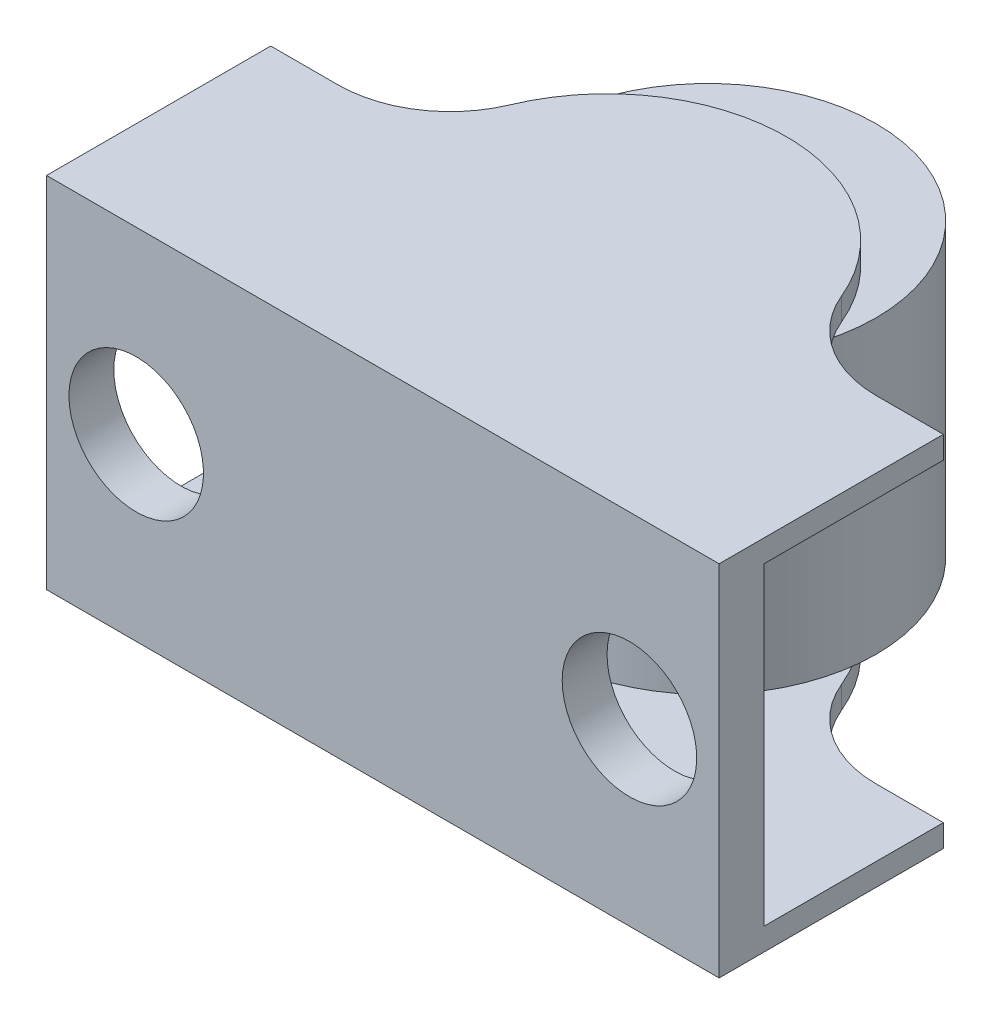
ISO-10303-21;
HEADER;
FILE_DESCRIPTION(('STEP AP214'),'2;1');
FILE_NAME('part.step','',(''),(''),'','','');
FILE_SCHEMA(('AUTOMOTIVE_DESIGN { 1 0 10303 214 1 1 1 1 }'));
ENDSEC;
DATA;
#1=APPLICATION_CONTEXT('core data for automotive mechanical design processes');
#2=APPLICATION_PROTOCOL_DEFINITION('international standard','automotive_design',2000,#1);
#3=PRODUCT_CONTEXT('',#1,'mechanical');
#4=PRODUCT('Part','Part','',(#3));
#5=PRODUCT_RELATED_PRODUCT_CATEGORY('part','',(#4));
#6=PRODUCT_DEFINITION_FORMATION('','',#4);
#7=PRODUCT_DEFINITION_CONTEXT('part definition',#1,'design');
#8=PRODUCT_DEFINITION('design','',#6,#7);
#9=PRODUCT_DEFINITION_SHAPE('','',#8);
#10=(LENGTH_UNIT() NAMED_UNIT(*) SI_UNIT(.MILLI.,.METRE.));
#11=(NAMED_UNIT(*) PLANE_ANGLE_UNIT() SI_UNIT($,.RADIAN.));
#12=(NAMED_UNIT(*) SI_UNIT($,.STERADIAN.) SOLID_ANGLE_UNIT());
#13=UNCERTAINTY_MEASURE_WITH_UNIT(LENGTH_MEASURE(1.E-05),#10,'distance_accuracy_value','');
#14=(GEOMETRIC_REPRESENTATION_CONTEXT(3) GLOBAL_UNCERTAINTY_ASSIGNED_CONTEXT((#13)) GLOBAL_UNIT_ASSIGNED_CONTEXT((#10,
#11,#12)) REPRESENTATION_CONTEXT('',''));
#15=CARTESIAN_POINT('',(0.,0.,0.));
#16=DIRECTION('',(0.,0.,1.));
#17=DIRECTION('',(1.,0.,0.));
#18=AXIS2_PLACEMENT_3D('',#15,#16,#17);
#19=CARTESIAN_POINT('',(0.,-14.0710678118655,-12.));
#20=DIRECTION('',(0.,1.,0.));
#21=DIRECTION('',(0.,0.,1.));
#22=AXIS2_PLACEMENT_3D('',#19,#20,#21);
#23=CYLINDRICAL_SURFACE('',#22,2.5);
#24=CARTESIAN_POINT('',(0.,-7.,-12.));
#25=DIRECTION('',(0.,-1.,0.));
#26=DIRECTION('',(0.,0.,-1.));
#27=AXIS2_PLACEMENT_3D('',#24,#25,#26);
#28=CIRCLE('',#27,2.5);
#29=CARTESIAN_POINT('',(0.,-7.,-14.5));
#30=VERTEX_POINT('',#29);
#31=EDGE_CURVE('E340',#30,#30,#28,.F.);
#32=ORIENTED_EDGE('',*,*,#31,.T.);
#33=EDGE_LOOP('',(#32));
#34=FACE_BOUND('',#33,.T.);
#35=CARTESIAN_POINT('',(0.,-6.5,-12.));
#36=DIRECTION('',(0.,1.,0.));
#37=DIRECTION('',(-1.,0.,0.));
#38=AXIS2_PLACEMENT_3D('',#35,#36,#37);
#39=CIRCLE('',#38,2.5);
#40=CARTESIAN_POINT('',(-2.5,-6.5,-12.));
#41=VERTEX_POINT('',#40);
#42=EDGE_CURVE('E42',#41,#41,#39,.F.);
#43=ORIENTED_EDGE('',*,*,#42,.T.);
#44=EDGE_LOOP('',(#43));
#45=FACE_BOUND('',#44,.T.);
#46=ADVANCED_FACE('F38',(#34,#45),#23,.T.);
#47=CARTESIAN_POINT('',(0.,7.,-12.));
#48=DIRECTION('',(0.,1.,0.));
#49=DIRECTION('',(0.,0.,1.));
#50=AXIS2_PLACEMENT_3D('',#47,#48,#49);
#51=CIRCLE('',#50,2.5);
#52=CARTESIAN_POINT('',(0.,7.,-9.5));
#53=VERTEX_POINT('',#52);
#54=EDGE_CURVE('E192',#53,#53,#51,.T.);
#55=ORIENTED_EDGE('',*,*,#54,.F.);
#56=EDGE_LOOP('',(#55));
#57=FACE_BOUND('',#56,.T.);
#58=CARTESIAN_POINT('',(0.,6.5,-12.));
#59=DIRECTION('',(0.,-1.,0.));
#60=DIRECTION('',(1.,0.,0.));
#61=AXIS2_PLACEMENT_3D('',#58,#59,#60);
#62=CIRCLE('',#61,2.5);
#63=CARTESIAN_POINT('',(2.5,6.5,-12.));
#64=VERTEX_POINT('',#63);
#65=EDGE_CURVE('E331',#64,#64,#62,.F.);
#66=ORIENTED_EDGE('',*,*,#65,.T.);
#67=EDGE_LOOP('',(#66));
#68=FACE_BOUND('',#67,.T.);
#69=ADVANCED_FACE('F362',(#57,#68),#23,.T.);
#70=CARTESIAN_POINT('',(0.,0.,0.));
#71=DIRECTION('',(0.,0.,1.));
#72=DIRECTION('',(1.,0.,0.));
#73=AXIS2_PLACEMENT_3D('',#70,#71,#72);
#74=PLANE('',#73);
#75=CARTESIAN_POINT('',(11.,0.,0.));
#76=DIRECTION('',(0.,0.,-1.));
#77=DIRECTION('',(-1.,0.,0.));
#78=AXIS2_PLACEMENT_3D('',#75,#76,#77);
#79=CIRCLE('',#78,3.);
#80=CARTESIAN_POINT('',(8.,0.,0.));
#81=VERTEX_POINT('',#80);
#82=EDGE_CURVE('E652',#81,#81,#79,.T.);
#83=ORIENTED_EDGE('',*,*,#82,.F.);
#84=EDGE_LOOP('',(#83));
#85=FACE_BOUND('',#84,.T.);
#86=CARTESIAN_POINT('',(-11.,0.,0.));
#87=DIRECTION('',(0.,0.,-1.));
#88=DIRECTION('',(-1.,0.,0.));
#89=AXIS2_PLACEMENT_3D('',#86,#87,#88);
#90=CIRCLE('',#89,3.);
#91=CARTESIAN_POINT('',(-14.,0.,0.));
#92=VERTEX_POINT('',#91);
#93=EDGE_CURVE('E660',#92,#92,#90,.T.);
#94=ORIENTED_EDGE('',*,*,#93,.F.);
#95=EDGE_LOOP('',(#94));
#96=FACE_BOUND('',#95,.T.);
#97=DIRECTION('',(1.,0.,0.));
#98=VECTOR('',#97,1.);
#99=CARTESIAN_POINT('',(-15.,-7.,0.));
#100=LINE('',#99,#98);
#101=CARTESIAN_POINT('',(-15.,-7.,0.));
#102=VERTEX_POINT('',#101);
#103=CARTESIAN_POINT('',(15.,-7.,0.));
#104=VERTEX_POINT('',#103);
#105=EDGE_CURVE('E178',#102,#104,#100,.T.);
#106=ORIENTED_EDGE('',*,*,#105,.F.);
#107=DIRECTION('',(0.,-1.,0.));
#108=VECTOR('',#107,1.);
#109=CARTESIAN_POINT('',(-15.,8.,0.));
#110=LINE('',#109,#108);
#111=CARTESIAN_POINT('',(-15.,7.,0.));
#112=VERTEX_POINT('',#111);
#113=EDGE_CURVE('E184',#112,#102,#110,.T.);
#114=ORIENTED_EDGE('',*,*,#113,.F.);
#115=DIRECTION('',(1.,0.,0.));
#116=VECTOR('',#115,1.);
#117=CARTESIAN_POINT('',(-15.,7.,0.));
#118=LINE('',#117,#116);
#119=CARTESIAN_POINT('',(15.,7.,0.));
#120=VERTEX_POINT('',#119);
#121=EDGE_CURVE('E243',#112,#120,#118,.T.);
#122=ORIENTED_EDGE('',*,*,#121,.T.);
#123=DIRECTION('',(0.,1.,0.));
#124=VECTOR('',#123,1.);
#125=CARTESIAN_POINT('',(15.,8.,0.));
#126=LINE('',#125,#124);
#127=EDGE_CURVE('E56',#104,#120,#126,.T.);
#128=ORIENTED_EDGE('',*,*,#127,.F.);
#129=EDGE_LOOP('',(#106,#114,#122,#128));
#130=FACE_BOUND('',#129,.T.);
#131=ADVANCED_FACE('F364',(#85,#96,#130),#74,.F.);
#132=CARTESIAN_POINT('',(15.,8.,2.));
#133=DIRECTION('',(-1.,0.,0.));
#134=DIRECTION('',(0.,0.,1.));
#135=AXIS2_PLACEMENT_3D('',#132,#133,#134);
#136=PLANE('',#135);
#137=DIRECTION('',(0.,0.,-1.));
#138=VECTOR('',#137,1.);
#139=CARTESIAN_POINT('',(15.,-8.,2.));
#140=LINE('',#139,#138);
#141=CARTESIAN_POINT('',(15.,-8.,2.));
#142=VERTEX_POINT('',#141);
#143=CARTESIAN_POINT('',(15.,-8.,-8.00000000000001));
#144=VERTEX_POINT('',#143);
#145=EDGE_CURVE('E320',#142,#144,#140,.T.);
#146=ORIENTED_EDGE('',*,*,#145,.T.);
#147=DIRECTION('',(0.,-1.,0.));
#148=VECTOR('',#147,1.);
#149=CARTESIAN_POINT('',(15.,-7.,-8.00000000000001));
#150=LINE('',#149,#148);
#151=CARTESIAN_POINT('',(15.,-7.,-8.00000000000001));
#152=VERTEX_POINT('',#151);
#153=EDGE_CURVE('E221',#152,#144,#150,.T.);
#154=ORIENTED_EDGE('',*,*,#153,.F.);
#155=DIRECTION('',(0.,0.,-1.));
#156=VECTOR('',#155,1.);
#157=CARTESIAN_POINT('',(15.,-7.,0.));
#158=LINE('',#157,#156);
#159=EDGE_CURVE('E206',#104,#152,#158,.T.);
#160=ORIENTED_EDGE('',*,*,#159,.F.);
#161=ORIENTED_EDGE('',*,*,#127,.T.);
#162=DIRECTION('',(0.,0.,-1.));
#163=VECTOR('',#162,1.);
#164=CARTESIAN_POINT('',(15.,7.,0.));
#165=LINE('',#164,#163);
#166=CARTESIAN_POINT('',(15.,7.,-8.00000000000001));
#167=VERTEX_POINT('',#166);
#168=EDGE_CURVE('E248',#120,#167,#165,.T.);
#169=ORIENTED_EDGE('',*,*,#168,.T.);
#170=DIRECTION('',(0.,1.,0.));
#171=VECTOR('',#170,1.);
#172=CARTESIAN_POINT('',(15.,7.,-8.00000000000001));
#173=LINE('',#172,#171);
#174=CARTESIAN_POINT('',(15.,8.,-8.00000000000001));
#175=VERTEX_POINT('',#174);
#176=EDGE_CURVE('E271',#167,#175,#173,.T.);
#177=ORIENTED_EDGE('',*,*,#176,.T.);
#178=DIRECTION('',(0.,0.,-1.));
#179=VECTOR('',#178,1.);
#180=CARTESIAN_POINT('',(15.,8.,2.));
#181=LINE('',#180,#179);
#182=CARTESIAN_POINT('',(15.,8.,2.));
#183=VERTEX_POINT('',#182);
#184=EDGE_CURVE('E11',#183,#175,#181,.T.);
#185=ORIENTED_EDGE('',*,*,#184,.F.);
#186=DIRECTION('',(0.,1.,0.));
#187=VECTOR('',#186,1.);
#188=CARTESIAN_POINT('',(15.,8.,2.));
#189=LINE('',#188,#187);
#190=EDGE_CURVE('E309',#142,#183,#189,.T.);
#191=ORIENTED_EDGE('',*,*,#190,.F.);
#192=EDGE_LOOP('',(#146,#154,#160,#161,#169,#177,#185,#191));
#193=FACE_BOUND('',#192,.T.);
#194=ADVANCED_FACE('F40',(#193),#136,.F.);
#195=CARTESIAN_POINT('',(-15.,8.,2.));
#196=DIRECTION('',(0.,-1.,0.));
#197=DIRECTION('',(0.,0.,-1.));
#198=AXIS2_PLACEMENT_3D('',#195,#196,#197);
#199=PLANE('',#198);
#200=ORIENTED_EDGE('',*,*,#184,.T.);
#201=DIRECTION('',(-1.,0.,0.));
#202=VECTOR('',#201,1.);
#203=CARTESIAN_POINT('',(15.,8.,-8.00000000000001));
#204=LINE('',#203,#202);
#205=CARTESIAN_POINT('',(12.,8.,-8.));
#206=VERTEX_POINT('',#205);
#207=EDGE_CURVE('E225',#175,#206,#204,.T.);
#208=ORIENTED_EDGE('',*,*,#207,.T.);
#209=CARTESIAN_POINT('',(12.,8.,-13.));
#210=DIRECTION('',(0.,-1.,0.));
#211=DIRECTION('',(0.,0.,-1.));
#212=AXIS2_PLACEMENT_3D('',#209,#210,#211);
#213=CIRCLE('',#212,5.);
#214=CARTESIAN_POINT('',(7.38461538461538,8.,-11.0769230769231));
#215=VERTEX_POINT('',#214);
#216=EDGE_CURVE('E275',#206,#215,#213,.T.);
#217=ORIENTED_EDGE('',*,*,#216,.T.);
#218=CARTESIAN_POINT('',(0.,8.,-8.));
#219=DIRECTION('',(0.,1.,0.));
#220=DIRECTION('',(0.,0.,1.));
#221=AXIS2_PLACEMENT_3D('',#218,#219,#220);
#222=CIRCLE('',#221,8.);
#223=CARTESIAN_POINT('',(-7.38461538461539,8.,-11.0769230769231));
#224=VERTEX_POINT('',#223);
#225=EDGE_CURVE('E279',#215,#224,#222,.T.);
#226=ORIENTED_EDGE('',*,*,#225,.T.);
#227=CARTESIAN_POINT('',(-12.,8.,-13.));
#228=DIRECTION('',(0.,-1.,0.));
#229=DIRECTION('',(0.,0.,1.));
#230=AXIS2_PLACEMENT_3D('',#227,#228,#229);
#231=CIRCLE('',#230,5.);
#232=CARTESIAN_POINT('',(-12.,8.,-7.99999999999999));
#233=VERTEX_POINT('',#232);
#234=EDGE_CURVE('E283',#224,#233,#231,.T.);
#235=ORIENTED_EDGE('',*,*,#234,.T.);
#236=DIRECTION('',(-1.,0.,0.));
#237=VECTOR('',#236,1.);
#238=CARTESIAN_POINT('',(-15.,8.,-8.));
#239=LINE('',#238,#237);
#240=CARTESIAN_POINT('',(-15.,8.,-8.));
#241=VERTEX_POINT('',#240);
#242=EDGE_CURVE('E244',#233,#241,#239,.T.);
#243=ORIENTED_EDGE('',*,*,#242,.T.);
#244=DIRECTION('',(0.,0.,-1.));
#245=VECTOR('',#244,1.);
#246=CARTESIAN_POINT('',(-15.,8.,2.));
#247=LINE('',#246,#245);
#248=CARTESIAN_POINT('',(-15.,8.,2.));
#249=VERTEX_POINT('',#248);
#250=EDGE_CURVE('E48',#249,#241,#247,.T.);
#251=ORIENTED_EDGE('',*,*,#250,.F.);
#252=DIRECTION('',(-1.,0.,0.));
#253=VECTOR('',#252,1.);
#254=CARTESIAN_POINT('',(-15.,8.,2.));
#255=LINE('',#254,#253);
#256=EDGE_CURVE('E312',#183,#249,#255,.T.);
#257=ORIENTED_EDGE('',*,*,#256,.F.);
#258=EDGE_LOOP('',(#200,#208,#217,#226,#235,#243,#251,#257));
#259=FACE_BOUND('',#258,.T.);
#260=ADVANCED_FACE('F429',(#259),#199,.F.);
#261=CARTESIAN_POINT('',(-15.,8.,2.));
#262=DIRECTION('',(1.,0.,0.));
#263=DIRECTION('',(0.,0.,-1.));
#264=AXIS2_PLACEMENT_3D('',#261,#262,#263);
#265=PLANE('',#264);
#266=ORIENTED_EDGE('',*,*,#250,.T.);
#267=DIRECTION('',(0.,1.,0.));
#268=VECTOR('',#267,1.);
#269=CARTESIAN_POINT('',(-15.,7.,-8.));
#270=LINE('',#269,#268);
#271=CARTESIAN_POINT('',(-15.,7.,-8.));
#272=VERTEX_POINT('',#271);
#273=EDGE_CURVE('E290',#272,#241,#270,.T.);
#274=ORIENTED_EDGE('',*,*,#273,.F.);
#275=DIRECTION('',(0.,0.,1.));
#276=VECTOR('',#275,1.);
#277=CARTESIAN_POINT('',(-15.,7.,0.));
#278=LINE('',#277,#276);
#279=EDGE_CURVE('E240',#272,#112,#278,.T.);
#280=ORIENTED_EDGE('',*,*,#279,.T.);
#281=ORIENTED_EDGE('',*,*,#113,.T.);
#282=DIRECTION('',(0.,0.,1.));
#283=VECTOR('',#282,1.);
#284=CARTESIAN_POINT('',(-15.,-7.,0.));
#285=LINE('',#284,#283);
#286=CARTESIAN_POINT('',(-15.,-7.,-8.));
#287=VERTEX_POINT('',#286);
#288=EDGE_CURVE('E159',#287,#102,#285,.T.);
#289=ORIENTED_EDGE('',*,*,#288,.F.);
#290=DIRECTION('',(0.,-1.,0.));
#291=VECTOR('',#290,1.);
#292=CARTESIAN_POINT('',(-15.,-7.,-8.));
#293=LINE('',#292,#291);
#294=CARTESIAN_POINT('',(-15.,-8.,-8.));
#295=VERTEX_POINT('',#294);
#296=EDGE_CURVE('E170',#287,#295,#293,.T.);
#297=ORIENTED_EDGE('',*,*,#296,.T.);
#298=DIRECTION('',(0.,0.,-1.));
#299=VECTOR('',#298,1.);
#300=CARTESIAN_POINT('',(-15.,-8.,2.));
#301=LINE('',#300,#299);
#302=CARTESIAN_POINT('',(-15.,-8.,2.));
#303=VERTEX_POINT('',#302);
#304=EDGE_CURVE('E327',#303,#295,#301,.T.);
#305=ORIENTED_EDGE('',*,*,#304,.F.);
#306=DIRECTION('',(0.,-1.,0.));
#307=VECTOR('',#306,1.);
#308=CARTESIAN_POINT('',(-15.,8.,2.));
#309=LINE('',#308,#307);
#310=EDGE_CURVE('E315',#249,#303,#309,.T.);
#311=ORIENTED_EDGE('',*,*,#310,.F.);
#312=EDGE_LOOP('',(#266,#274,#280,#281,#289,#297,#305,#311));
#313=FACE_BOUND('',#312,.T.);
#314=ADVANCED_FACE('F181',(#313),#265,.F.);
#315=CARTESIAN_POINT('',(-15.,-8.,2.));
#316=DIRECTION('',(0.,1.,0.));
#317=DIRECTION('',(0.,0.,1.));
#318=AXIS2_PLACEMENT_3D('',#315,#316,#317);
#319=PLANE('',#318);
#320=ORIENTED_EDGE('',*,*,#304,.T.);
#321=DIRECTION('',(-1.,0.,0.));
#322=VECTOR('',#321,1.);
#323=CARTESIAN_POINT('',(-15.,-8.,-8.));
#324=LINE('',#323,#322);
#325=CARTESIAN_POINT('',(-12.,-8.,-7.99999999999999));
#326=VERTEX_POINT('',#325);
#327=EDGE_CURVE('E173',#326,#295,#324,.T.);
#328=ORIENTED_EDGE('',*,*,#327,.F.);
#329=CARTESIAN_POINT('',(-12.,-8.,-13.));
#330=DIRECTION('',(0.,-1.,0.));
#331=DIRECTION('',(0.,0.,1.));
#332=AXIS2_PLACEMENT_3D('',#329,#330,#331);
#333=CIRCLE('',#332,5.);
#334=CARTESIAN_POINT('',(-7.38461538461539,-8.,-11.0769230769231));
#335=VERTEX_POINT('',#334);
#336=EDGE_CURVE('E213',#335,#326,#333,.T.);
#337=ORIENTED_EDGE('',*,*,#336,.F.);
#338=CARTESIAN_POINT('',(0.,-8.,-8.));
#339=DIRECTION('',(0.,1.,0.));
#340=DIRECTION('',(0.,0.,1.));
#341=AXIS2_PLACEMENT_3D('',#338,#339,#340);
#342=CIRCLE('',#341,8.);
#343=CARTESIAN_POINT('',(7.38461538461538,-8.,-11.0769230769231));
#344=VERTEX_POINT('',#343);
#345=EDGE_CURVE('E216',#344,#335,#342,.T.);
#346=ORIENTED_EDGE('',*,*,#345,.F.);
#347=CARTESIAN_POINT('',(12.,-8.,-13.));
#348=DIRECTION('',(0.,-1.,0.));
#349=DIRECTION('',(0.,0.,-1.));
#350=AXIS2_PLACEMENT_3D('',#347,#348,#349);
#351=CIRCLE('',#350,5.);
#352=CARTESIAN_POINT('',(12.,-8.,-8.));
#353=VERTEX_POINT('',#352);
#354=EDGE_CURVE('E189',#353,#344,#351,.T.);
#355=ORIENTED_EDGE('',*,*,#354,.F.);
#356=DIRECTION('',(-1.,0.,0.));
#357=VECTOR('',#356,1.);
#358=CARTESIAN_POINT('',(15.,-8.,-8.00000000000001));
#359=LINE('',#358,#357);
#360=EDGE_CURVE('E186',#144,#353,#359,.T.);
#361=ORIENTED_EDGE('',*,*,#360,.F.);
#362=ORIENTED_EDGE('',*,*,#145,.F.);
#363=DIRECTION('',(1.,0.,0.));
#364=VECTOR('',#363,1.);
#365=CARTESIAN_POINT('',(-15.,-8.,2.));
#366=LINE('',#365,#364);
#367=EDGE_CURVE('E64',#303,#142,#366,.T.);
#368=ORIENTED_EDGE('',*,*,#367,.F.);
#369=EDGE_LOOP('',(#320,#328,#337,#346,#355,#361,#362,#368));
#370=FACE_BOUND('',#369,.T.);
#371=ADVANCED_FACE('F422',(#370),#319,.F.);
#372=CARTESIAN_POINT('',(0.,0.,2.));
#373=DIRECTION('',(0.,0.,1.));
#374=DIRECTION('',(1.,0.,0.));
#375=AXIS2_PLACEMENT_3D('',#372,#373,#374);
#376=PLANE('',#375);
#377=CARTESIAN_POINT('',(11.,0.,2.));
#378=DIRECTION('',(0.,0.,-1.));
#379=DIRECTION('',(-1.,0.,0.));
#380=AXIS2_PLACEMENT_3D('',#377,#378,#379);
#381=CIRCLE('',#380,3.);
#382=CARTESIAN_POINT('',(8.,0.,2.));
#383=VERTEX_POINT('',#382);
#384=EDGE_CURVE('E348',#383,#383,#381,.T.);
#385=ORIENTED_EDGE('',*,*,#384,.T.);
#386=EDGE_LOOP('',(#385));
#387=FACE_BOUND('',#386,.T.);
#388=CARTESIAN_POINT('',(-11.,0.,2.));
#389=DIRECTION('',(0.,0.,-1.));
#390=DIRECTION('',(-1.,0.,0.));
#391=AXIS2_PLACEMENT_3D('',#388,#389,#390);
#392=CIRCLE('',#391,3.);
#393=CARTESIAN_POINT('',(-14.,0.,2.));
#394=VERTEX_POINT('',#393);
#395=EDGE_CURVE('E654',#394,#394,#392,.T.);
#396=ORIENTED_EDGE('',*,*,#395,.T.);
#397=EDGE_LOOP('',(#396));
#398=FACE_BOUND('',#397,.T.);
#399=ORIENTED_EDGE('',*,*,#190,.T.);
#400=ORIENTED_EDGE('',*,*,#256,.T.);
#401=ORIENTED_EDGE('',*,*,#310,.T.);
#402=ORIENTED_EDGE('',*,*,#367,.T.);
#403=EDGE_LOOP('',(#399,#400,#401,#402));
#404=FACE_BOUND('',#403,.T.);
#405=ADVANCED_FACE('F405',(#387,#398,#404),#376,.T.);
#406=CARTESIAN_POINT('',(-15.,7.,-8.));
#407=DIRECTION('',(0.,0.,-1.));
#408=DIRECTION('',(-1.,0.,0.));
#409=AXIS2_PLACEMENT_3D('',#406,#407,#408);
#410=PLANE('',#409);
#411=ORIENTED_EDGE('',*,*,#242,.F.);
#412=DIRECTION('',(0.,1.,0.));
#413=VECTOR('',#412,1.);
#414=CARTESIAN_POINT('',(-12.,7.,-7.99999999999999));
#415=LINE('',#414,#413);
#416=CARTESIAN_POINT('',(-12.,7.,-7.99999999999999));
#417=VERTEX_POINT('',#416);
#418=EDGE_CURVE('E294',#417,#233,#415,.T.);
#419=ORIENTED_EDGE('',*,*,#418,.F.);
#420=DIRECTION('',(-1.,0.,0.));
#421=VECTOR('',#420,1.);
#422=CARTESIAN_POINT('',(-15.,7.,-8.));
#423=LINE('',#422,#421);
#424=EDGE_CURVE('E267',#417,#272,#423,.T.);
#425=ORIENTED_EDGE('',*,*,#424,.T.);
#426=ORIENTED_EDGE('',*,*,#273,.T.);
#427=EDGE_LOOP('',(#411,#419,#425,#426));
#428=FACE_BOUND('',#427,.T.);
#429=ADVANCED_FACE('F401',(#428),#410,.T.);
#430=CARTESIAN_POINT('',(-12.,7.,-13.));
#431=DIRECTION('',(0.,1.,0.));
#432=DIRECTION('',(0.,0.,1.));
#433=AXIS2_PLACEMENT_3D('',#430,#431,#432);
#434=CYLINDRICAL_SURFACE('',#433,5.);
#435=ORIENTED_EDGE('',*,*,#234,.F.);
#436=DIRECTION('',(0.,1.,0.));
#437=VECTOR('',#436,1.);
#438=CARTESIAN_POINT('',(-7.38461538461539,7.,-11.0769230769231));
#439=LINE('',#438,#437);
#440=CARTESIAN_POINT('',(-7.38461538461539,7.,-11.0769230769231));
#441=VERTEX_POINT('',#440);
#442=EDGE_CURVE('E297',#441,#224,#439,.T.);
#443=ORIENTED_EDGE('',*,*,#442,.F.);
#444=CARTESIAN_POINT('',(-12.,7.,-13.));
#445=DIRECTION('',(0.,-1.,0.));
#446=DIRECTION('',(0.,0.,1.));
#447=AXIS2_PLACEMENT_3D('',#444,#445,#446);
#448=CIRCLE('',#447,5.);
#449=EDGE_CURVE('E263',#441,#417,#448,.T.);
#450=ORIENTED_EDGE('',*,*,#449,.T.);
#451=ORIENTED_EDGE('',*,*,#418,.T.);
#452=EDGE_LOOP('',(#435,#443,#450,#451));
#453=FACE_BOUND('',#452,.T.);
#454=ADVANCED_FACE('F404',(#453),#434,.F.);
#455=CARTESIAN_POINT('',(0.,7.,-8.));
#456=DIRECTION('',(0.,1.,0.));
#457=DIRECTION('',(0.,0.,1.));
#458=AXIS2_PLACEMENT_3D('',#455,#456,#457);
#459=CYLINDRICAL_SURFACE('',#458,8.);
#460=ORIENTED_EDGE('',*,*,#225,.F.);
#461=DIRECTION('',(0.,1.,0.));
#462=VECTOR('',#461,1.);
#463=CARTESIAN_POINT('',(7.38461538461538,7.,-11.0769230769231));
#464=LINE('',#463,#462);
#465=CARTESIAN_POINT('',(7.38461538461538,7.,-11.0769230769231));
#466=VERTEX_POINT('',#465);
#467=EDGE_CURVE('E300',#466,#215,#464,.T.);
#468=ORIENTED_EDGE('',*,*,#467,.F.);
#469=CARTESIAN_POINT('',(0.,7.,-8.));
#470=DIRECTION('',(0.,1.,0.));
#471=DIRECTION('',(0.,0.,1.));
#472=AXIS2_PLACEMENT_3D('',#469,#470,#471);
#473=CIRCLE('',#472,8.);
#474=EDGE_CURVE('E259',#466,#441,#473,.T.);
#475=ORIENTED_EDGE('',*,*,#474,.T.);
#476=ORIENTED_EDGE('',*,*,#442,.T.);
#477=EDGE_LOOP('',(#460,#468,#475,#476));
#478=FACE_BOUND('',#477,.T.);
#479=ADVANCED_FACE('F409',(#478),#459,.T.);
#480=CARTESIAN_POINT('',(12.,7.,-13.));
#481=DIRECTION('',(0.,1.,0.));
#482=DIRECTION('',(0.,0.,1.));
#483=AXIS2_PLACEMENT_3D('',#480,#481,#482);
#484=CYLINDRICAL_SURFACE('',#483,5.);
#485=ORIENTED_EDGE('',*,*,#216,.F.);
#486=DIRECTION('',(0.,1.,0.));
#487=VECTOR('',#486,1.);
#488=CARTESIAN_POINT('',(12.,7.,-8.));
#489=LINE('',#488,#487);
#490=CARTESIAN_POINT('',(12.,7.,-8.));
#491=VERTEX_POINT('',#490);
#492=EDGE_CURVE('E303',#491,#206,#489,.T.);
#493=ORIENTED_EDGE('',*,*,#492,.F.);
#494=CARTESIAN_POINT('',(12.,7.,-13.));
#495=DIRECTION('',(0.,-1.,0.));
#496=DIRECTION('',(0.,0.,-1.));
#497=AXIS2_PLACEMENT_3D('',#494,#495,#496);
#498=CIRCLE('',#497,5.);
#499=EDGE_CURVE('E255',#491,#466,#498,.T.);
#500=ORIENTED_EDGE('',*,*,#499,.T.);
#501=ORIENTED_EDGE('',*,*,#467,.T.);
#502=EDGE_LOOP('',(#485,#493,#500,#501));
#503=FACE_BOUND('',#502,.T.);
#504=ADVANCED_FACE('F413',(#503),#484,.F.);
#505=CARTESIAN_POINT('',(15.,7.,-8.00000000000001));
#506=DIRECTION('',(0.,0.,-1.));
#507=DIRECTION('',(-1.,0.,0.));
#508=AXIS2_PLACEMENT_3D('',#505,#506,#507);
#509=PLANE('',#508);
#510=ORIENTED_EDGE('',*,*,#207,.F.);
#511=ORIENTED_EDGE('',*,*,#176,.F.);
#512=DIRECTION('',(-1.,0.,0.));
#513=VECTOR('',#512,1.);
#514=CARTESIAN_POINT('',(15.,7.,-8.00000000000001));
#515=LINE('',#514,#513);
#516=EDGE_CURVE('E251',#167,#491,#515,.T.);
#517=ORIENTED_EDGE('',*,*,#516,.T.);
#518=ORIENTED_EDGE('',*,*,#492,.T.);
#519=EDGE_LOOP('',(#510,#511,#517,#518));
#520=FACE_BOUND('',#519,.T.);
#521=ADVANCED_FACE('F400',(#520),#509,.T.);
#522=CARTESIAN_POINT('',(-12.,7.,-13.));
#523=DIRECTION('',(0.,1.,0.));
#524=DIRECTION('',(0.,0.,1.));
#525=AXIS2_PLACEMENT_3D('',#522,#523,#524);
#526=PLANE('',#525);
#527=ORIENTED_EDGE('',*,*,#54,.T.);
#528=EDGE_LOOP('',(#527));
#529=FACE_BOUND('',#528,.T.);
#530=ORIENTED_EDGE('',*,*,#279,.F.);
#531=ORIENTED_EDGE('',*,*,#424,.F.);
#532=ORIENTED_EDGE('',*,*,#449,.F.);
#533=ORIENTED_EDGE('',*,*,#474,.F.);
#534=ORIENTED_EDGE('',*,*,#499,.F.);
#535=ORIENTED_EDGE('',*,*,#516,.F.);
#536=ORIENTED_EDGE('',*,*,#168,.F.);
#537=ORIENTED_EDGE('',*,*,#121,.F.);
#538=EDGE_LOOP('',(#530,#531,#532,#533,#534,#535,#536,#537));
#539=FACE_BOUND('',#538,.T.);
#540=ADVANCED_FACE('F359',(#529,#539),#526,.F.);
#541=CARTESIAN_POINT('',(15.,-7.,-8.00000000000001));
#542=DIRECTION('',(0.,0.,1.));
#543=DIRECTION('',(1.,0.,0.));
#544=AXIS2_PLACEMENT_3D('',#541,#542,#543);
#545=PLANE('',#544);
#546=ORIENTED_EDGE('',*,*,#360,.T.);
#547=DIRECTION('',(0.,-1.,0.));
#548=VECTOR('',#547,1.);
#549=CARTESIAN_POINT('',(12.,-7.,-8.));
#550=LINE('',#549,#548);
#551=CARTESIAN_POINT('',(12.,-7.,-8.));
#552=VERTEX_POINT('',#551);
#553=EDGE_CURVE('E226',#552,#353,#550,.T.);
#554=ORIENTED_EDGE('',*,*,#553,.F.);
#555=DIRECTION('',(-1.,0.,0.));
#556=VECTOR('',#555,1.);
#557=CARTESIAN_POINT('',(15.,-7.,-8.00000000000001));
#558=LINE('',#557,#556);
#559=EDGE_CURVE('E203',#152,#552,#558,.T.);
#560=ORIENTED_EDGE('',*,*,#559,.F.);
#561=ORIENTED_EDGE('',*,*,#153,.T.);
#562=EDGE_LOOP('',(#546,#554,#560,#561));
#563=FACE_BOUND('',#562,.T.);
#564=ADVANCED_FACE('F380',(#563),#545,.F.);
#565=CARTESIAN_POINT('',(12.,-7.,-13.));
#566=DIRECTION('',(0.,-1.,0.));
#567=DIRECTION('',(0.,0.,-1.));
#568=AXIS2_PLACEMENT_3D('',#565,#566,#567);
#569=CYLINDRICAL_SURFACE('',#568,5.);
#570=ORIENTED_EDGE('',*,*,#354,.T.);
#571=DIRECTION('',(0.,-1.,0.));
#572=VECTOR('',#571,1.);
#573=CARTESIAN_POINT('',(7.38461538461538,-7.,-11.0769230769231));
#574=LINE('',#573,#572);
#575=CARTESIAN_POINT('',(7.38461538461538,-7.,-11.0769230769231));
#576=VERTEX_POINT('',#575);
#577=EDGE_CURVE('E230',#576,#344,#574,.T.);
#578=ORIENTED_EDGE('',*,*,#577,.F.);
#579=CARTESIAN_POINT('',(12.,-7.,-13.));
#580=DIRECTION('',(0.,-1.,0.));
#581=DIRECTION('',(0.,0.,-1.));
#582=AXIS2_PLACEMENT_3D('',#579,#580,#581);
#583=CIRCLE('',#582,5.);
#584=EDGE_CURVE('E200',#552,#576,#583,.T.);
#585=ORIENTED_EDGE('',*,*,#584,.F.);
#586=ORIENTED_EDGE('',*,*,#553,.T.);
#587=EDGE_LOOP('',(#570,#578,#585,#586));
#588=FACE_BOUND('',#587,.T.);
#589=ADVANCED_FACE('F383',(#588),#569,.F.);
#590=CARTESIAN_POINT('',(0.,-7.,-8.));
#591=DIRECTION('',(0.,-1.,0.));
#592=DIRECTION('',(0.,0.,-1.));
#593=AXIS2_PLACEMENT_3D('',#590,#591,#592);
#594=CYLINDRICAL_SURFACE('',#593,8.);
#595=ORIENTED_EDGE('',*,*,#345,.T.);
#596=DIRECTION('',(0.,-1.,0.));
#597=VECTOR('',#596,1.);
#598=CARTESIAN_POINT('',(-7.38461538461539,-7.,-11.0769230769231));
#599=LINE('',#598,#597);
#600=CARTESIAN_POINT('',(-7.38461538461539,-7.,-11.0769230769231));
#601=VERTEX_POINT('',#600);
#602=EDGE_CURVE('E234',#601,#335,#599,.T.);
#603=ORIENTED_EDGE('',*,*,#602,.F.);
#604=CARTESIAN_POINT('',(0.,-7.,-8.));
#605=DIRECTION('',(0.,1.,0.));
#606=DIRECTION('',(0.,0.,1.));
#607=AXIS2_PLACEMENT_3D('',#604,#605,#606);
#608=CIRCLE('',#607,8.);
#609=EDGE_CURVE('E197',#576,#601,#608,.T.);
#610=ORIENTED_EDGE('',*,*,#609,.F.);
#611=ORIENTED_EDGE('',*,*,#577,.T.);
#612=EDGE_LOOP('',(#595,#603,#610,#611));
#613=FACE_BOUND('',#612,.T.);
#614=ADVANCED_FACE('F387',(#613),#594,.T.);
#615=CARTESIAN_POINT('',(-12.,-7.,-13.));
#616=DIRECTION('',(0.,-1.,0.));
#617=DIRECTION('',(0.,0.,-1.));
#618=AXIS2_PLACEMENT_3D('',#615,#616,#617);
#619=CYLINDRICAL_SURFACE('',#618,5.);
#620=ORIENTED_EDGE('',*,*,#336,.T.);
#621=DIRECTION('',(0.,-1.,0.));
#622=VECTOR('',#621,1.);
#623=CARTESIAN_POINT('',(-12.,-7.,-7.99999999999999));
#624=LINE('',#623,#622);
#625=CARTESIAN_POINT('',(-12.,-7.,-7.99999999999999));
#626=VERTEX_POINT('',#625);
#627=EDGE_CURVE('E177',#626,#326,#624,.T.);
#628=ORIENTED_EDGE('',*,*,#627,.F.);
#629=CARTESIAN_POINT('',(-12.,-7.,-13.));
#630=DIRECTION('',(0.,-1.,0.));
#631=DIRECTION('',(0.,0.,1.));
#632=AXIS2_PLACEMENT_3D('',#629,#630,#631);
#633=CIRCLE('',#632,5.);
#634=EDGE_CURVE('E162',#601,#626,#633,.T.);
#635=ORIENTED_EDGE('',*,*,#634,.F.);
#636=ORIENTED_EDGE('',*,*,#602,.T.);
#637=EDGE_LOOP('',(#620,#628,#635,#636));
#638=FACE_BOUND('',#637,.T.);
#639=ADVANCED_FACE('F391',(#638),#619,.F.);
#640=CARTESIAN_POINT('',(-15.,-7.,-8.));
#641=DIRECTION('',(0.,0.,1.));
#642=DIRECTION('',(1.,0.,0.));
#643=AXIS2_PLACEMENT_3D('',#640,#641,#642);
#644=PLANE('',#643);
#645=ORIENTED_EDGE('',*,*,#327,.T.);
#646=ORIENTED_EDGE('',*,*,#296,.F.);
#647=DIRECTION('',(-1.,0.,0.));
#648=VECTOR('',#647,1.);
#649=CARTESIAN_POINT('',(-15.,-7.,-8.));
#650=LINE('',#649,#648);
#651=EDGE_CURVE('E155',#626,#287,#650,.T.);
#652=ORIENTED_EDGE('',*,*,#651,.F.);
#653=ORIENTED_EDGE('',*,*,#627,.T.);
#654=EDGE_LOOP('',(#645,#646,#652,#653));
#655=FACE_BOUND('',#654,.T.);
#656=ADVANCED_FACE('F171',(#655),#644,.F.);
#657=CARTESIAN_POINT('',(-12.,-7.,-13.));
#658=DIRECTION('',(0.,-1.,0.));
#659=DIRECTION('',(0.,0.,1.));
#660=AXIS2_PLACEMENT_3D('',#657,#658,#659);
#661=PLANE('',#660);
#662=ORIENTED_EDGE('',*,*,#31,.F.);
#663=EDGE_LOOP('',(#662));
#664=FACE_BOUND('',#663,.T.);
#665=ORIENTED_EDGE('',*,*,#288,.T.);
#666=ORIENTED_EDGE('',*,*,#105,.T.);
#667=ORIENTED_EDGE('',*,*,#159,.T.);
#668=ORIENTED_EDGE('',*,*,#559,.T.);
#669=ORIENTED_EDGE('',*,*,#584,.T.);
#670=ORIENTED_EDGE('',*,*,#609,.T.);
#671=ORIENTED_EDGE('',*,*,#634,.T.);
#672=ORIENTED_EDGE('',*,*,#651,.T.);
#673=EDGE_LOOP('',(#665,#666,#667,#668,#669,#670,#671,#672));
#674=FACE_BOUND('',#673,.T.);
#675=ADVANCED_FACE('F157',(#664,#674),#661,.F.);
#676=CARTESIAN_POINT('',(0.,-6.5,-12.5));
#677=DIRECTION('',(0.,1.,0.));
#678=DIRECTION('',(-1.,0.,0.));
#679=AXIS2_PLACEMENT_3D('',#676,#677,#678);
#680=PLANE('',#679);
#681=ORIENTED_EDGE('',*,*,#42,.F.);
#682=EDGE_LOOP('',(#681));
#683=FACE_BOUND('',#682,.T.);
#684=CARTESIAN_POINT('',(0.,-6.5,-12.5));
#685=DIRECTION('',(0.,1.,0.));
#686=DIRECTION('',(-1.,0.,0.));
#687=AXIS2_PLACEMENT_3D('',#684,#685,#686);
#688=CIRCLE('',#687,7.5);
#689=CARTESIAN_POINT('',(-7.5,-6.49999999999999,-12.5));
#690=VERTEX_POINT('',#689);
#691=EDGE_CURVE('E334',#690,#690,#688,.T.);
#692=ORIENTED_EDGE('',*,*,#691,.F.);
#693=EDGE_LOOP('',(#692));
#694=FACE_BOUND('',#693,.T.);
#695=ADVANCED_FACE('F375',(#683,#694),#680,.F.);
#696=CARTESIAN_POINT('',(0.,6.5,-12.5));
#697=DIRECTION('',(0.,1.,0.));
#698=DIRECTION('',(-1.,0.,0.));
#699=AXIS2_PLACEMENT_3D('',#696,#697,#698);
#700=CYLINDRICAL_SURFACE('',#699,7.5);
#701=CARTESIAN_POINT('',(0.,6.5,-12.5));
#702=DIRECTION('',(0.,1.,0.));
#703=DIRECTION('',(-1.,0.,0.));
#704=AXIS2_PLACEMENT_3D('',#701,#702,#703);
#705=CIRCLE('',#704,7.5);
#706=CARTESIAN_POINT('',(-7.5,6.5,-12.5));
#707=VERTEX_POINT('',#706);
#708=EDGE_CURVE('E342',#707,#707,#705,.T.);
#709=ORIENTED_EDGE('',*,*,#708,.F.);
#710=EDGE_LOOP('',(#709));
#711=FACE_BOUND('',#710,.T.);
#712=ORIENTED_EDGE('',*,*,#691,.T.);
#713=EDGE_LOOP('',(#712));
#714=FACE_BOUND('',#713,.T.);
#715=ADVANCED_FACE('F507',(#711,#714),#700,.T.);
#716=CARTESIAN_POINT('',(0.,6.5,-12.5));
#717=DIRECTION('',(0.,-1.,0.));
#718=DIRECTION('',(1.,0.,0.));
#719=AXIS2_PLACEMENT_3D('',#716,#717,#718);
#720=PLANE('',#719);
#721=ORIENTED_EDGE('',*,*,#65,.F.);
#722=EDGE_LOOP('',(#721));
#723=FACE_BOUND('',#722,.T.);
#724=ORIENTED_EDGE('',*,*,#708,.T.);
#725=EDGE_LOOP('',(#724));
#726=FACE_BOUND('',#725,.T.);
#727=ADVANCED_FACE('F475',(#723,#726),#720,.F.);
#728=CARTESIAN_POINT('',(-11.,0.,2.));
#729=DIRECTION('',(0.,0.,-1.));
#730=DIRECTION('',(-1.,0.,0.));
#731=AXIS2_PLACEMENT_3D('',#728,#729,#730);
#732=CYLINDRICAL_SURFACE('',#731,3.);
#733=ORIENTED_EDGE('',*,*,#395,.F.);
#734=EDGE_LOOP('',(#733));
#735=FACE_BOUND('',#734,.T.);
#736=ORIENTED_EDGE('',*,*,#93,.T.);
#737=EDGE_LOOP('',(#736));
#738=FACE_BOUND('',#737,.T.);
#739=ADVANCED_FACE('F485',(#735,#738),#732,.F.);
#740=CARTESIAN_POINT('',(11.,0.,2.));
#741=DIRECTION('',(0.,0.,-1.));
#742=DIRECTION('',(-1.,0.,0.));
#743=AXIS2_PLACEMENT_3D('',#740,#741,#742);
#744=CYLINDRICAL_SURFACE('',#743,3.);
#745=ORIENTED_EDGE('',*,*,#384,.F.);
#746=EDGE_LOOP('',(#745));
#747=FACE_BOUND('',#746,.T.);
#748=ORIENTED_EDGE('',*,*,#82,.T.);
#749=EDGE_LOOP('',(#748));
#750=FACE_BOUND('',#749,.T.);
#751=ADVANCED_FACE('F490',(#747,#750),#744,.F.);
#752=CLOSED_SHELL('',(#46,#69,#131,#194,#260,#314,#371,#405,#429,#454,#479,#504,#521,#540,#564,
#589,#614,#639,#656,#675,#695,#715,#727,#739,#751));
#753=MANIFOLD_SOLID_BREP('B2',#752);
#754=ADVANCED_BREP_SHAPE_REPRESENTATION('',(#18,#753),#14);
#755=SHAPE_DEFINITION_REPRESENTATION(#9,#754);
ENDSEC;
END-ISO-10303-21;
